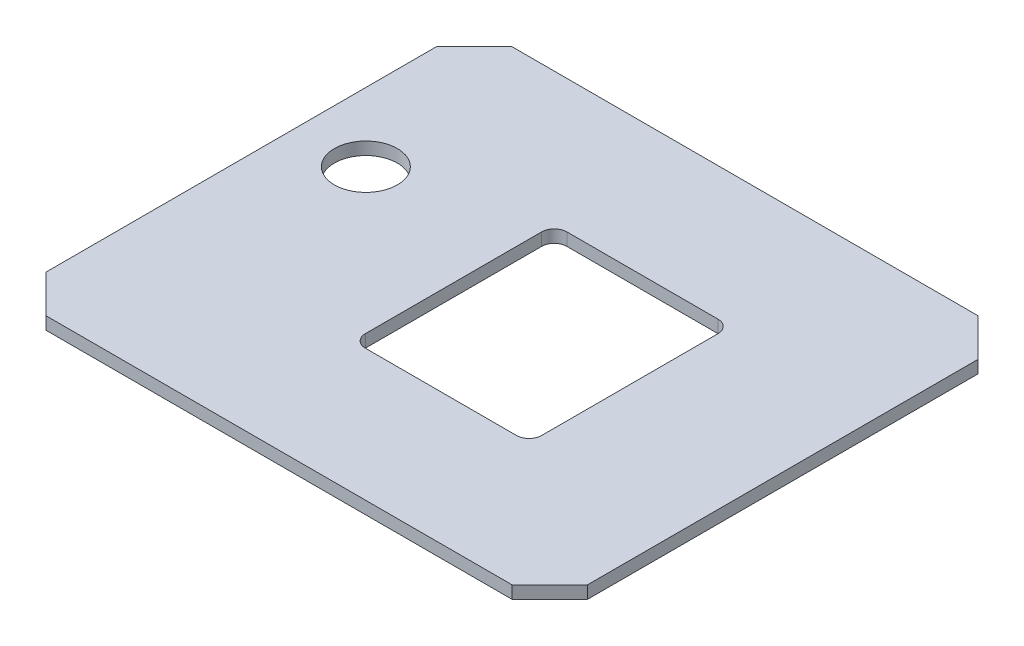
ISO-10303-21;
HEADER;
FILE_DESCRIPTION(('STEP AP214'),'2;1');
FILE_NAME('part.step','',(''),(''),'','','');
FILE_SCHEMA(('AUTOMOTIVE_DESIGN { 1 0 10303 214 1 1 1 1 }'));
ENDSEC;
DATA;
#1=APPLICATION_CONTEXT('core data for automotive mechanical design processes');
#2=APPLICATION_PROTOCOL_DEFINITION('international standard','automotive_design',2000,#1);
#3=PRODUCT_CONTEXT('',#1,'mechanical');
#4=PRODUCT('Part','Part','',(#3));
#5=PRODUCT_RELATED_PRODUCT_CATEGORY('part','',(#4));
#6=PRODUCT_DEFINITION_FORMATION('','',#4);
#7=PRODUCT_DEFINITION_CONTEXT('part definition',#1,'design');
#8=PRODUCT_DEFINITION('design','',#6,#7);
#9=PRODUCT_DEFINITION_SHAPE('','',#8);
#10=(LENGTH_UNIT() NAMED_UNIT(*) SI_UNIT(.MILLI.,.METRE.));
#11=(NAMED_UNIT(*) PLANE_ANGLE_UNIT() SI_UNIT($,.RADIAN.));
#12=(NAMED_UNIT(*) SI_UNIT($,.STERADIAN.) SOLID_ANGLE_UNIT());
#13=UNCERTAINTY_MEASURE_WITH_UNIT(LENGTH_MEASURE(1.E-05),#10,'distance_accuracy_value','');
#14=(GEOMETRIC_REPRESENTATION_CONTEXT(3) GLOBAL_UNCERTAINTY_ASSIGNED_CONTEXT((#13)) GLOBAL_UNIT_ASSIGNED_CONTEXT((#10,
#11,#12)) REPRESENTATION_CONTEXT('',''));
#15=CARTESIAN_POINT('',(0.,0.,0.));
#16=DIRECTION('',(0.,0.,1.));
#17=DIRECTION('',(1.,0.,0.));
#18=AXIS2_PLACEMENT_3D('',#15,#16,#17);
#19=CARTESIAN_POINT('',(0.,0.,0.));
#20=DIRECTION('',(0.,1.,0.));
#21=DIRECTION('',(1.,0.,0.));
#22=AXIS2_PLACEMENT_3D('',#19,#20,#21);
#23=PLANE('',#22);
#24=CARTESIAN_POINT('',(-184.6,0.,-45.));
#25=DIRECTION('',(0.,1.,0.));
#26=DIRECTION('',(0.,0.,1.));
#27=AXIS2_PLACEMENT_3D('',#24,#25,#26);
#28=CIRCLE('',#27,25.);
#29=CARTESIAN_POINT('',(-184.6,0.,-20.));
#30=VERTEX_POINT('',#29);
#31=EDGE_CURVE('E359',#30,#30,#28,.T.);
#32=ORIENTED_EDGE('',*,*,#31,.T.);
#33=EDGE_LOOP('',(#32));
#34=FACE_BOUND('',#33,.T.);
#35=CARTESIAN_POINT('',(60.,0.,-70.));
#36=DIRECTION('',(0.,1.,0.));
#37=DIRECTION('',(0.,0.,1.));
#38=AXIS2_PLACEMENT_3D('',#35,#36,#37);
#39=CIRCLE('',#38,10.);
#40=CARTESIAN_POINT('',(70.,0.,-70.));
#41=VERTEX_POINT('',#40);
#42=CARTESIAN_POINT('',(60.,0.,-80.));
#43=VERTEX_POINT('',#42);
#44=EDGE_CURVE('E284',#41,#43,#39,.T.);
#45=ORIENTED_EDGE('',*,*,#44,.T.);
#46=DIRECTION('',(-1.,0.,0.));
#47=VECTOR('',#46,1.);
#48=CARTESIAN_POINT('',(-70.,0.,-80.));
#49=LINE('',#48,#47);
#50=CARTESIAN_POINT('',(-60.,0.,-80.));
#51=VERTEX_POINT('',#50);
#52=EDGE_CURVE('E302',#43,#51,#49,.T.);
#53=ORIENTED_EDGE('',*,*,#52,.T.);
#54=CARTESIAN_POINT('',(-60.,0.,-70.));
#55=DIRECTION('',(0.,1.,0.));
#56=DIRECTION('',(0.,0.,1.));
#57=AXIS2_PLACEMENT_3D('',#54,#55,#56);
#58=CIRCLE('',#57,10.);
#59=CARTESIAN_POINT('',(-70.,0.,-70.));
#60=VERTEX_POINT('',#59);
#61=EDGE_CURVE('E237',#51,#60,#58,.T.);
#62=ORIENTED_EDGE('',*,*,#61,.T.);
#63=DIRECTION('',(0.,0.,1.));
#64=VECTOR('',#63,1.);
#65=CARTESIAN_POINT('',(-70.,0.,80.));
#66=LINE('',#65,#64);
#67=CARTESIAN_POINT('',(-70.,0.,70.));
#68=VERTEX_POINT('',#67);
#69=EDGE_CURVE('E312',#60,#68,#66,.T.);
#70=ORIENTED_EDGE('',*,*,#69,.T.);
#71=CARTESIAN_POINT('',(-60.,0.,70.));
#72=DIRECTION('',(0.,1.,0.));
#73=DIRECTION('',(0.,0.,1.));
#74=AXIS2_PLACEMENT_3D('',#71,#72,#73);
#75=CIRCLE('',#74,10.);
#76=CARTESIAN_POINT('',(-60.,0.,80.));
#77=VERTEX_POINT('',#76);
#78=EDGE_CURVE('E320',#68,#77,#75,.T.);
#79=ORIENTED_EDGE('',*,*,#78,.T.);
#80=DIRECTION('',(1.,0.,0.));
#81=VECTOR('',#80,1.);
#82=CARTESIAN_POINT('',(70.,0.,80.));
#83=LINE('',#82,#81);
#84=CARTESIAN_POINT('',(60.,0.,80.));
#85=VERTEX_POINT('',#84);
#86=EDGE_CURVE('E296',#77,#85,#83,.T.);
#87=ORIENTED_EDGE('',*,*,#86,.T.);
#88=CARTESIAN_POINT('',(60.,0.,70.));
#89=DIRECTION('',(0.,1.,0.));
#90=DIRECTION('',(0.,0.,1.));
#91=AXIS2_PLACEMENT_3D('',#88,#89,#90);
#92=CIRCLE('',#91,10.);
#93=CARTESIAN_POINT('',(70.,0.,70.));
#94=VERTEX_POINT('',#93);
#95=EDGE_CURVE('E257',#85,#94,#92,.T.);
#96=ORIENTED_EDGE('',*,*,#95,.T.);
#97=DIRECTION('',(0.,0.,-1.));
#98=VECTOR('',#97,1.);
#99=CARTESIAN_POINT('',(70.,0.,-80.));
#100=LINE('',#99,#98);
#101=EDGE_CURVE('E256',#94,#41,#100,.T.);
#102=ORIENTED_EDGE('',*,*,#101,.T.);
#103=EDGE_LOOP('',(#45,#53,#62,#70,#79,#87,#96,#102));
#104=FACE_BOUND('',#103,.T.);
#105=DIRECTION('',(0.707106781186549,0.,0.707106781186546));
#106=VECTOR('',#105,1.);
#107=CARTESIAN_POINT('',(190.888539522842,2.22044604925032E-13,-155.547778770997));
#108=LINE('',#107,#106);
#109=CARTESIAN_POINT('',(160.888539522842,1.11022302462516E-13,-185.547778770997));
#110=VERTEX_POINT('',#109);
#111=CARTESIAN_POINT('',(190.888539522842,0.,-155.547778770997));
#112=VERTEX_POINT('',#111);
#113=EDGE_CURVE('E26',#110,#112,#108,.T.);
#114=ORIENTED_EDGE('',*,*,#113,.T.);
#115=DIRECTION('',(0.,0.,-1.));
#116=VECTOR('',#115,1.);
#117=CARTESIAN_POINT('',(190.888539522842,0.,-185.547778770997));
#118=LINE('',#117,#116);
#119=CARTESIAN_POINT('',(190.888539522842,0.,154.452221229003));
#120=VERTEX_POINT('',#119);
#121=EDGE_CURVE('E11',#120,#112,#118,.T.);
#122=ORIENTED_EDGE('',*,*,#121,.F.);
#123=DIRECTION('',(-0.707106781186546,0.,0.707106781186549));
#124=VECTOR('',#123,1.);
#125=CARTESIAN_POINT('',(160.888539522842,2.22044604925032E-13,184.452221229003));
#126=LINE('',#125,#124);
#127=CARTESIAN_POINT('',(160.888539522842,0.,184.452221229003));
#128=VERTEX_POINT('',#127);
#129=EDGE_CURVE('E316',#120,#128,#126,.T.);
#130=ORIENTED_EDGE('',*,*,#129,.T.);
#131=DIRECTION('',(1.,0.,0.));
#132=VECTOR('',#131,1.);
#133=CARTESIAN_POINT('',(190.888539522842,0.,184.452221229003));
#134=LINE('',#133,#132);
#135=CARTESIAN_POINT('',(-209.111460477158,0.,184.452221229003));
#136=VERTEX_POINT('',#135);
#137=EDGE_CURVE('E253',#136,#128,#134,.T.);
#138=ORIENTED_EDGE('',*,*,#137,.F.);
#139=DIRECTION('',(-0.707106781186549,0.,-0.707106781186547));
#140=VECTOR('',#139,1.);
#141=CARTESIAN_POINT('',(-239.111460477159,0.,154.452221229003));
#142=LINE('',#141,#140);
#143=CARTESIAN_POINT('',(-239.111460477159,0.,154.452221229003));
#144=VERTEX_POINT('',#143);
#145=EDGE_CURVE('E342',#136,#144,#142,.T.);
#146=ORIENTED_EDGE('',*,*,#145,.T.);
#147=DIRECTION('',(0.,0.,1.));
#148=VECTOR('',#147,1.);
#149=CARTESIAN_POINT('',(-239.111460477159,0.,-185.547778770997));
#150=LINE('',#149,#148);
#151=CARTESIAN_POINT('',(-239.111460477159,1.11022302462516E-13,-155.547778770996));
#152=VERTEX_POINT('',#151);
#153=EDGE_CURVE('E175',#152,#144,#150,.T.);
#154=ORIENTED_EDGE('',*,*,#153,.F.);
#155=DIRECTION('',(0.707106781186546,0.,-0.707106781186549));
#156=VECTOR('',#155,1.);
#157=CARTESIAN_POINT('',(-209.111460477158,2.22044604925032E-13,-185.547778770997));
#158=LINE('',#157,#156);
#159=CARTESIAN_POINT('',(-209.111460477158,0.,-185.547778770997));
#160=VERTEX_POINT('',#159);
#161=EDGE_CURVE('E171',#152,#160,#158,.T.);
#162=ORIENTED_EDGE('',*,*,#161,.T.);
#163=DIRECTION('',(-1.,0.,0.));
#164=VECTOR('',#163,1.);
#165=CARTESIAN_POINT('',(190.888539522842,0.,-185.547778770997));
#166=LINE('',#165,#164);
#167=EDGE_CURVE('E161',#110,#160,#166,.T.);
#168=ORIENTED_EDGE('',*,*,#167,.F.);
#169=EDGE_LOOP('',(#114,#122,#130,#138,#146,#154,#162,#168));
#170=FACE_BOUND('',#169,.T.);
#171=ADVANCED_FACE('F17',(#34,#104,#170),#23,.F.);
#172=CARTESIAN_POINT('',(190.888539522842,-567.274184147314,-185.547778770997));
#173=DIRECTION('',(1.,0.,0.));
#174=DIRECTION('',(0.,0.,-1.));
#175=AXIS2_PLACEMENT_3D('',#172,#173,#174);
#176=PLANE('',#175);
#177=DIRECTION('',(0.,0.,-1.));
#178=VECTOR('',#177,1.);
#179=CARTESIAN_POINT('',(190.888539522842,10.,0.));
#180=LINE('',#179,#178);
#181=CARTESIAN_POINT('',(190.888539522842,10.,154.452221229003));
#182=VERTEX_POINT('',#181);
#183=CARTESIAN_POINT('',(190.888539522842,10.,-155.547778770997));
#184=VERTEX_POINT('',#183);
#185=EDGE_CURVE('E211',#182,#184,#180,.T.);
#186=ORIENTED_EDGE('',*,*,#185,.F.);
#187=DIRECTION('',(0.,-1.,0.));
#188=VECTOR('',#187,1.);
#189=CARTESIAN_POINT('',(190.888539522842,-567.274184147314,154.452221229003));
#190=LINE('',#189,#188);
#191=EDGE_CURVE('E213',#182,#120,#190,.T.);
#192=ORIENTED_EDGE('',*,*,#191,.T.);
#193=ORIENTED_EDGE('',*,*,#121,.T.);
#194=DIRECTION('',(0.,1.,0.));
#195=VECTOR('',#194,1.);
#196=CARTESIAN_POINT('',(190.888539522842,-567.274184147314,-155.547778770997));
#197=LINE('',#196,#195);
#198=EDGE_CURVE('E195',#112,#184,#197,.T.);
#199=ORIENTED_EDGE('',*,*,#198,.T.);
#200=EDGE_LOOP('',(#186,#192,#193,#199));
#201=FACE_BOUND('',#200,.T.);
#202=ADVANCED_FACE('F210',(#201),#176,.T.);
#203=CARTESIAN_POINT('',(190.888539522842,-567.274184147314,-155.547778770997));
#204=DIRECTION('',(-0.707106781186546,0.,0.707106781186549));
#205=DIRECTION('',(0.,1.,0.));
#206=AXIS2_PLACEMENT_3D('',#203,#204,#205);
#207=PLANE('',#206);
#208=DIRECTION('',(0.,-1.,0.));
#209=VECTOR('',#208,1.);
#210=CARTESIAN_POINT('',(160.888539522842,-567.274184147314,-185.547778770997));
#211=LINE('',#210,#209);
#212=CARTESIAN_POINT('',(160.888539522842,10.0000000000002,-185.547778770997));
#213=VERTEX_POINT('',#212);
#214=EDGE_CURVE('E168',#213,#110,#211,.T.);
#215=ORIENTED_EDGE('',*,*,#214,.F.);
#216=DIRECTION('',(-0.707106781186549,0.,-0.707106781186546));
#217=VECTOR('',#216,1.);
#218=CARTESIAN_POINT('',(190.888539522842,10.,-155.547778770997));
#219=LINE('',#218,#217);
#220=EDGE_CURVE('E207',#184,#213,#219,.T.);
#221=ORIENTED_EDGE('',*,*,#220,.F.);
#222=ORIENTED_EDGE('',*,*,#198,.F.);
#223=ORIENTED_EDGE('',*,*,#113,.F.);
#224=EDGE_LOOP('',(#215,#221,#222,#223));
#225=FACE_BOUND('',#224,.T.);
#226=ADVANCED_FACE('F205',(#225),#207,.F.);
#227=CARTESIAN_POINT('',(190.888539522842,-567.274184147314,-185.547778770997));
#228=DIRECTION('',(0.,0.,-1.));
#229=DIRECTION('',(-1.,0.,0.));
#230=AXIS2_PLACEMENT_3D('',#227,#228,#229);
#231=PLANE('',#230);
#232=ORIENTED_EDGE('',*,*,#167,.T.);
#233=DIRECTION('',(0.,1.,0.));
#234=VECTOR('',#233,1.);
#235=CARTESIAN_POINT('',(-209.111460477158,-567.274184147314,-185.547778770997));
#236=LINE('',#235,#234);
#237=CARTESIAN_POINT('',(-209.111460477158,10.,-185.547778770997));
#238=VERTEX_POINT('',#237);
#239=EDGE_CURVE('E166',#160,#238,#236,.T.);
#240=ORIENTED_EDGE('',*,*,#239,.T.);
#241=DIRECTION('',(-1.,0.,0.));
#242=VECTOR('',#241,1.);
#243=CARTESIAN_POINT('',(0.,10.,-185.547778770997));
#244=LINE('',#243,#242);
#245=EDGE_CURVE('E261',#213,#238,#244,.T.);
#246=ORIENTED_EDGE('',*,*,#245,.F.);
#247=ORIENTED_EDGE('',*,*,#214,.T.);
#248=EDGE_LOOP('',(#232,#240,#246,#247));
#249=FACE_BOUND('',#248,.T.);
#250=ADVANCED_FACE('F163',(#249),#231,.T.);
#251=CARTESIAN_POINT('',(-209.111460477158,-567.274184147314,-185.547778770997));
#252=DIRECTION('',(0.707106781186549,0.,0.707106781186546));
#253=DIRECTION('',(0.,-1.,0.));
#254=AXIS2_PLACEMENT_3D('',#251,#252,#253);
#255=PLANE('',#254);
#256=DIRECTION('',(0.,-1.,0.));
#257=VECTOR('',#256,1.);
#258=CARTESIAN_POINT('',(-239.111460477159,-567.274184147314,-155.547778770996));
#259=LINE('',#258,#257);
#260=CARTESIAN_POINT('',(-239.111460477159,10.0000000000002,-155.547778770996));
#261=VERTEX_POINT('',#260);
#262=EDGE_CURVE('E185',#261,#152,#259,.T.);
#263=ORIENTED_EDGE('',*,*,#262,.F.);
#264=DIRECTION('',(-0.707106781186546,0.,0.707106781186549));
#265=VECTOR('',#264,1.);
#266=CARTESIAN_POINT('',(-209.111460477158,10.,-185.547778770997));
#267=LINE('',#266,#265);
#268=EDGE_CURVE('E182',#238,#261,#267,.T.);
#269=ORIENTED_EDGE('',*,*,#268,.F.);
#270=ORIENTED_EDGE('',*,*,#239,.F.);
#271=ORIENTED_EDGE('',*,*,#161,.F.);
#272=EDGE_LOOP('',(#263,#269,#270,#271));
#273=FACE_BOUND('',#272,.T.);
#274=ADVANCED_FACE('F180',(#273),#255,.F.);
#275=CARTESIAN_POINT('',(-239.111460477159,-567.274184147314,-185.547778770997));
#276=DIRECTION('',(-1.,0.,0.));
#277=DIRECTION('',(0.,0.,1.));
#278=AXIS2_PLACEMENT_3D('',#275,#276,#277);
#279=PLANE('',#278);
#280=ORIENTED_EDGE('',*,*,#153,.T.);
#281=DIRECTION('',(0.,1.,0.));
#282=VECTOR('',#281,1.);
#283=CARTESIAN_POINT('',(-239.111460477159,-567.274184147314,154.452221229003));
#284=LINE('',#283,#282);
#285=CARTESIAN_POINT('',(-239.111460477159,10.,154.452221229003));
#286=VERTEX_POINT('',#285);
#287=EDGE_CURVE('E252',#144,#286,#284,.T.);
#288=ORIENTED_EDGE('',*,*,#287,.T.);
#289=DIRECTION('',(0.,0.,1.));
#290=VECTOR('',#289,1.);
#291=CARTESIAN_POINT('',(-239.111460477159,10.,0.));
#292=LINE('',#291,#290);
#293=EDGE_CURVE('E243',#261,#286,#292,.T.);
#294=ORIENTED_EDGE('',*,*,#293,.F.);
#295=ORIENTED_EDGE('',*,*,#262,.T.);
#296=EDGE_LOOP('',(#280,#288,#294,#295));
#297=FACE_BOUND('',#296,.T.);
#298=ADVANCED_FACE('F622',(#297),#279,.T.);
#299=CARTESIAN_POINT('',(-239.111460477159,-567.274184147314,154.452221229003));
#300=DIRECTION('',(0.707106781186547,0.,-0.707106781186548));
#301=DIRECTION('',(0.,-1.,0.));
#302=AXIS2_PLACEMENT_3D('',#299,#300,#301);
#303=PLANE('',#302);
#304=DIRECTION('',(0.,-1.,0.));
#305=VECTOR('',#304,1.);
#306=CARTESIAN_POINT('',(-209.111460477158,-567.274184147314,184.452221229003));
#307=LINE('',#306,#305);
#308=CARTESIAN_POINT('',(-209.111460477158,10.,184.452221229003));
#309=VERTEX_POINT('',#308);
#310=EDGE_CURVE('E248',#309,#136,#307,.T.);
#311=ORIENTED_EDGE('',*,*,#310,.F.);
#312=DIRECTION('',(0.707106781186548,0.,0.707106781186547));
#313=VECTOR('',#312,1.);
#314=CARTESIAN_POINT('',(-239.111460477159,10.,154.452221229003));
#315=LINE('',#314,#313);
#316=EDGE_CURVE('E247',#286,#309,#315,.T.);
#317=ORIENTED_EDGE('',*,*,#316,.F.);
#318=ORIENTED_EDGE('',*,*,#287,.F.);
#319=ORIENTED_EDGE('',*,*,#145,.F.);
#320=EDGE_LOOP('',(#311,#317,#318,#319));
#321=FACE_BOUND('',#320,.T.);
#322=ADVANCED_FACE('F599',(#321),#303,.F.);
#323=CARTESIAN_POINT('',(190.888539522842,-567.274184147314,184.452221229003));
#324=DIRECTION('',(0.,0.,1.));
#325=DIRECTION('',(1.,0.,0.));
#326=AXIS2_PLACEMENT_3D('',#323,#324,#325);
#327=PLANE('',#326);
#328=ORIENTED_EDGE('',*,*,#137,.T.);
#329=DIRECTION('',(0.,1.,0.));
#330=VECTOR('',#329,1.);
#331=CARTESIAN_POINT('',(160.888539522842,-567.274184147314,184.452221229003));
#332=LINE('',#331,#330);
#333=CARTESIAN_POINT('',(160.888539522842,10.,184.452221229003));
#334=VERTEX_POINT('',#333);
#335=EDGE_CURVE('E313',#128,#334,#332,.T.);
#336=ORIENTED_EDGE('',*,*,#335,.T.);
#337=DIRECTION('',(1.,0.,0.));
#338=VECTOR('',#337,1.);
#339=CARTESIAN_POINT('',(0.,10.,184.452221229003));
#340=LINE('',#339,#338);
#341=EDGE_CURVE('E223',#309,#334,#340,.T.);
#342=ORIENTED_EDGE('',*,*,#341,.F.);
#343=ORIENTED_EDGE('',*,*,#310,.T.);
#344=EDGE_LOOP('',(#328,#336,#342,#343));
#345=FACE_BOUND('',#344,.T.);
#346=ADVANCED_FACE('F591',(#345),#327,.T.);
#347=CARTESIAN_POINT('',(160.888539522842,-567.274184147314,184.452221229003));
#348=DIRECTION('',(-0.707106781186549,0.,-0.707106781186546));
#349=DIRECTION('',(-0.707106781186546,0.,0.707106781186549));
#350=AXIS2_PLACEMENT_3D('',#347,#348,#349);
#351=PLANE('',#350);
#352=ORIENTED_EDGE('',*,*,#191,.F.);
#353=DIRECTION('',(0.707106781186546,0.,-0.707106781186549));
#354=VECTOR('',#353,1.);
#355=CARTESIAN_POINT('',(160.888539522842,10.,184.452221229003));
#356=LINE('',#355,#354);
#357=EDGE_CURVE('E216',#334,#182,#356,.T.);
#358=ORIENTED_EDGE('',*,*,#357,.F.);
#359=ORIENTED_EDGE('',*,*,#335,.F.);
#360=ORIENTED_EDGE('',*,*,#129,.F.);
#361=EDGE_LOOP('',(#352,#358,#359,#360));
#362=FACE_BOUND('',#361,.T.);
#363=ADVANCED_FACE('F587',(#362),#351,.F.);
#364=CARTESIAN_POINT('',(70.,0.,-80.));
#365=DIRECTION('',(1.,0.,0.));
#366=DIRECTION('',(0.,1.,0.));
#367=AXIS2_PLACEMENT_3D('',#364,#365,#366);
#368=PLANE('',#367);
#369=ORIENTED_EDGE('',*,*,#101,.F.);
#370=DIRECTION('',(0.,1.,0.));
#371=VECTOR('',#370,1.);
#372=CARTESIAN_POINT('',(70.,-13.036,70.));
#373=LINE('',#372,#371);
#374=CARTESIAN_POINT('',(70.,10.,70.));
#375=VERTEX_POINT('',#374);
#376=EDGE_CURVE('E254',#94,#375,#373,.T.);
#377=ORIENTED_EDGE('',*,*,#376,.T.);
#378=DIRECTION('',(0.,0.,1.));
#379=VECTOR('',#378,1.);
#380=CARTESIAN_POINT('',(70.,10.,0.));
#381=LINE('',#380,#379);
#382=CARTESIAN_POINT('',(70.,10.,-70.));
#383=VERTEX_POINT('',#382);
#384=EDGE_CURVE('E241',#383,#375,#381,.T.);
#385=ORIENTED_EDGE('',*,*,#384,.F.);
#386=DIRECTION('',(0.,-1.,0.));
#387=VECTOR('',#386,1.);
#388=CARTESIAN_POINT('',(70.,-13.036,-70.));
#389=LINE('',#388,#387);
#390=EDGE_CURVE('E288',#383,#41,#389,.T.);
#391=ORIENTED_EDGE('',*,*,#390,.T.);
#392=EDGE_LOOP('',(#369,#377,#385,#391));
#393=FACE_BOUND('',#392,.T.);
#394=ADVANCED_FACE('F405',(#393),#368,.F.);
#395=CARTESIAN_POINT('',(60.,-13.036,70.));
#396=DIRECTION('',(0.,1.,0.));
#397=DIRECTION('',(0.,0.,1.));
#398=AXIS2_PLACEMENT_3D('',#395,#396,#397);
#399=CYLINDRICAL_SURFACE('',#398,10.);
#400=ORIENTED_EDGE('',*,*,#95,.F.);
#401=DIRECTION('',(0.,1.,0.));
#402=VECTOR('',#401,1.);
#403=CARTESIAN_POINT('',(60.,0.,80.));
#404=LINE('',#403,#402);
#405=CARTESIAN_POINT('',(60.,10.,80.));
#406=VERTEX_POINT('',#405);
#407=EDGE_CURVE('E327',#85,#406,#404,.T.);
#408=ORIENTED_EDGE('',*,*,#407,.T.);
#409=CARTESIAN_POINT('',(60.,10.,70.));
#410=DIRECTION('',(0.,-1.,0.));
#411=DIRECTION('',(0.,0.,1.));
#412=AXIS2_PLACEMENT_3D('',#409,#410,#411);
#413=CIRCLE('',#412,10.);
#414=EDGE_CURVE('E272',#375,#406,#413,.T.);
#415=ORIENTED_EDGE('',*,*,#414,.F.);
#416=ORIENTED_EDGE('',*,*,#376,.F.);
#417=EDGE_LOOP('',(#400,#408,#415,#416));
#418=FACE_BOUND('',#417,.T.);
#419=ADVANCED_FACE('F378',(#418),#399,.F.);
#420=CARTESIAN_POINT('',(70.,0.,80.));
#421=DIRECTION('',(0.,0.,1.));
#422=DIRECTION('',(1.,0.,0.));
#423=AXIS2_PLACEMENT_3D('',#420,#421,#422);
#424=PLANE('',#423);
#425=DIRECTION('',(-1.,0.,0.));
#426=VECTOR('',#425,1.);
#427=CARTESIAN_POINT('',(0.,10.,80.));
#428=LINE('',#427,#426);
#429=CARTESIAN_POINT('',(-60.,10.,80.));
#430=VERTEX_POINT('',#429);
#431=EDGE_CURVE('E267',#406,#430,#428,.T.);
#432=ORIENTED_EDGE('',*,*,#431,.F.);
#433=ORIENTED_EDGE('',*,*,#407,.F.);
#434=ORIENTED_EDGE('',*,*,#86,.F.);
#435=DIRECTION('',(0.,1.,0.));
#436=VECTOR('',#435,1.);
#437=CARTESIAN_POINT('',(-60.,-13.036,80.));
#438=LINE('',#437,#436);
#439=EDGE_CURVE('E324',#77,#430,#438,.T.);
#440=ORIENTED_EDGE('',*,*,#439,.T.);
#441=EDGE_LOOP('',(#432,#433,#434,#440));
#442=FACE_BOUND('',#441,.T.);
#443=ADVANCED_FACE('F381',(#442),#424,.F.);
#444=CARTESIAN_POINT('',(-60.,-13.036,70.));
#445=DIRECTION('',(0.,1.,0.));
#446=DIRECTION('',(0.,0.,1.));
#447=AXIS2_PLACEMENT_3D('',#444,#445,#446);
#448=CYLINDRICAL_SURFACE('',#447,10.);
#449=ORIENTED_EDGE('',*,*,#78,.F.);
#450=DIRECTION('',(0.,1.,0.));
#451=VECTOR('',#450,1.);
#452=CARTESIAN_POINT('',(-70.,0.,70.));
#453=LINE('',#452,#451);
#454=CARTESIAN_POINT('',(-70.,10.,70.));
#455=VERTEX_POINT('',#454);
#456=EDGE_CURVE('E309',#68,#455,#453,.T.);
#457=ORIENTED_EDGE('',*,*,#456,.T.);
#458=CARTESIAN_POINT('',(-60.,10.,70.));
#459=DIRECTION('',(0.,-1.,0.));
#460=DIRECTION('',(0.,0.,1.));
#461=AXIS2_PLACEMENT_3D('',#458,#459,#460);
#462=CIRCLE('',#461,10.);
#463=EDGE_CURVE('E271',#430,#455,#462,.T.);
#464=ORIENTED_EDGE('',*,*,#463,.F.);
#465=ORIENTED_EDGE('',*,*,#439,.F.);
#466=EDGE_LOOP('',(#449,#457,#464,#465));
#467=FACE_BOUND('',#466,.T.);
#468=ADVANCED_FACE('F385',(#467),#448,.F.);
#469=CARTESIAN_POINT('',(-70.,0.,80.));
#470=DIRECTION('',(-1.,0.,0.));
#471=DIRECTION('',(0.,0.,1.));
#472=AXIS2_PLACEMENT_3D('',#469,#470,#471);
#473=PLANE('',#472);
#474=DIRECTION('',(0.,0.,-1.));
#475=VECTOR('',#474,1.);
#476=CARTESIAN_POINT('',(-70.,10.,0.));
#477=LINE('',#476,#475);
#478=CARTESIAN_POINT('',(-70.,10.,-70.));
#479=VERTEX_POINT('',#478);
#480=EDGE_CURVE('E276',#455,#479,#477,.T.);
#481=ORIENTED_EDGE('',*,*,#480,.F.);
#482=ORIENTED_EDGE('',*,*,#456,.F.);
#483=ORIENTED_EDGE('',*,*,#69,.F.);
#484=DIRECTION('',(0.,1.,0.));
#485=VECTOR('',#484,1.);
#486=CARTESIAN_POINT('',(-70.,-13.036,-70.));
#487=LINE('',#486,#485);
#488=EDGE_CURVE('E306',#60,#479,#487,.T.);
#489=ORIENTED_EDGE('',*,*,#488,.T.);
#490=EDGE_LOOP('',(#481,#482,#483,#489));
#491=FACE_BOUND('',#490,.T.);
#492=ADVANCED_FACE('F391',(#491),#473,.F.);
#493=CARTESIAN_POINT('',(-60.,-13.036,-70.));
#494=DIRECTION('',(0.,1.,0.));
#495=DIRECTION('',(0.,0.,1.));
#496=AXIS2_PLACEMENT_3D('',#493,#494,#495);
#497=CYLINDRICAL_SURFACE('',#496,10.);
#498=ORIENTED_EDGE('',*,*,#61,.F.);
#499=DIRECTION('',(0.,1.,0.));
#500=VECTOR('',#499,1.);
#501=CARTESIAN_POINT('',(-60.,0.,-80.));
#502=LINE('',#501,#500);
#503=CARTESIAN_POINT('',(-60.,10.,-80.));
#504=VERTEX_POINT('',#503);
#505=EDGE_CURVE('E299',#51,#504,#502,.T.);
#506=ORIENTED_EDGE('',*,*,#505,.T.);
#507=CARTESIAN_POINT('',(-60.,10.,-70.));
#508=DIRECTION('',(0.,-1.,0.));
#509=DIRECTION('',(0.,0.,1.));
#510=AXIS2_PLACEMENT_3D('',#507,#508,#509);
#511=CIRCLE('',#510,10.);
#512=EDGE_CURVE('E280',#479,#504,#511,.T.);
#513=ORIENTED_EDGE('',*,*,#512,.F.);
#514=ORIENTED_EDGE('',*,*,#488,.F.);
#515=EDGE_LOOP('',(#498,#506,#513,#514));
#516=FACE_BOUND('',#515,.T.);
#517=ADVANCED_FACE('F395',(#516),#497,.F.);
#518=CARTESIAN_POINT('',(-70.,0.,-80.));
#519=DIRECTION('',(0.,0.,-1.));
#520=DIRECTION('',(0.,-1.,0.));
#521=AXIS2_PLACEMENT_3D('',#518,#519,#520);
#522=PLANE('',#521);
#523=DIRECTION('',(1.,0.,0.));
#524=VECTOR('',#523,1.);
#525=CARTESIAN_POINT('',(0.,10.,-80.));
#526=LINE('',#525,#524);
#527=CARTESIAN_POINT('',(60.,10.,-80.));
#528=VERTEX_POINT('',#527);
#529=EDGE_CURVE('E242',#504,#528,#526,.T.);
#530=ORIENTED_EDGE('',*,*,#529,.F.);
#531=ORIENTED_EDGE('',*,*,#505,.F.);
#532=ORIENTED_EDGE('',*,*,#52,.F.);
#533=DIRECTION('',(0.,1.,0.));
#534=VECTOR('',#533,1.);
#535=CARTESIAN_POINT('',(60.,-13.036,-80.));
#536=LINE('',#535,#534);
#537=EDGE_CURVE('E292',#43,#528,#536,.T.);
#538=ORIENTED_EDGE('',*,*,#537,.T.);
#539=EDGE_LOOP('',(#530,#531,#532,#538));
#540=FACE_BOUND('',#539,.T.);
#541=ADVANCED_FACE('F398',(#540),#522,.F.);
#542=CARTESIAN_POINT('',(60.,-13.036,-70.));
#543=DIRECTION('',(0.,1.,0.));
#544=DIRECTION('',(0.,0.,1.));
#545=AXIS2_PLACEMENT_3D('',#542,#543,#544);
#546=CYLINDRICAL_SURFACE('',#545,10.);
#547=ORIENTED_EDGE('',*,*,#44,.F.);
#548=ORIENTED_EDGE('',*,*,#390,.F.);
#549=CARTESIAN_POINT('',(60.,10.,-70.));
#550=DIRECTION('',(0.,-1.,0.));
#551=DIRECTION('',(0.,0.,1.));
#552=AXIS2_PLACEMENT_3D('',#549,#550,#551);
#553=CIRCLE('',#552,10.);
#554=EDGE_CURVE('E238',#528,#383,#553,.T.);
#555=ORIENTED_EDGE('',*,*,#554,.F.);
#556=ORIENTED_EDGE('',*,*,#537,.F.);
#557=EDGE_LOOP('',(#547,#548,#555,#556));
#558=FACE_BOUND('',#557,.T.);
#559=ADVANCED_FACE('F403',(#558),#546,.F.);
#560=CARTESIAN_POINT('',(0.,10.,0.));
#561=DIRECTION('',(0.,1.,0.));
#562=DIRECTION('',(1.,0.,0.));
#563=AXIS2_PLACEMENT_3D('',#560,#561,#562);
#564=PLANE('',#563);
#565=CARTESIAN_POINT('',(-184.6,10.,-45.));
#566=DIRECTION('',(0.,-1.,0.));
#567=DIRECTION('',(0.,0.,1.));
#568=AXIS2_PLACEMENT_3D('',#565,#566,#567);
#569=CIRCLE('',#568,25.);
#570=CARTESIAN_POINT('',(-184.6,10.,-20.));
#571=VERTEX_POINT('',#570);
#572=EDGE_CURVE('E233',#571,#571,#569,.T.);
#573=ORIENTED_EDGE('',*,*,#572,.T.);
#574=EDGE_LOOP('',(#573));
#575=FACE_BOUND('',#574,.T.);
#576=ORIENTED_EDGE('',*,*,#529,.T.);
#577=ORIENTED_EDGE('',*,*,#554,.T.);
#578=ORIENTED_EDGE('',*,*,#384,.T.);
#579=ORIENTED_EDGE('',*,*,#414,.T.);
#580=ORIENTED_EDGE('',*,*,#431,.T.);
#581=ORIENTED_EDGE('',*,*,#463,.T.);
#582=ORIENTED_EDGE('',*,*,#480,.T.);
#583=ORIENTED_EDGE('',*,*,#512,.T.);
#584=EDGE_LOOP('',(#576,#577,#578,#579,#580,#581,#582,#583));
#585=FACE_BOUND('',#584,.T.);
#586=ORIENTED_EDGE('',*,*,#341,.T.);
#587=ORIENTED_EDGE('',*,*,#357,.T.);
#588=ORIENTED_EDGE('',*,*,#185,.T.);
#589=ORIENTED_EDGE('',*,*,#220,.T.);
#590=ORIENTED_EDGE('',*,*,#245,.T.);
#591=ORIENTED_EDGE('',*,*,#268,.T.);
#592=ORIENTED_EDGE('',*,*,#293,.T.);
#593=ORIENTED_EDGE('',*,*,#316,.T.);
#594=EDGE_LOOP('',(#586,#587,#588,#589,#590,#591,#592,#593));
#595=FACE_BOUND('',#594,.T.);
#596=ADVANCED_FACE('F220',(#575,#585,#595),#564,.T.);
#597=CARTESIAN_POINT('',(-184.6,0.,-45.));
#598=DIRECTION('',(0.,1.,0.));
#599=DIRECTION('',(0.,0.,1.));
#600=AXIS2_PLACEMENT_3D('',#597,#598,#599);
#601=CYLINDRICAL_SURFACE('',#600,25.);
#602=ORIENTED_EDGE('',*,*,#572,.F.);
#603=EDGE_LOOP('',(#602));
#604=FACE_BOUND('',#603,.T.);
#605=ORIENTED_EDGE('',*,*,#31,.F.);
#606=EDGE_LOOP('',(#605));
#607=FACE_BOUND('',#606,.T.);
#608=ADVANCED_FACE('F440',(#604,#607),#601,.F.);
#609=CLOSED_SHELL('',(#171,#202,#226,#250,#274,#298,#322,#346,#363,#394,#419,#443,#468,#492,
#517,#541,#559,#596,#608));
#610=MANIFOLD_SOLID_BREP('B1',#609);
#611=ADVANCED_BREP_SHAPE_REPRESENTATION('',(#18,#610),#14);
#612=SHAPE_DEFINITION_REPRESENTATION(#9,#611);
ENDSEC;
END-ISO-10303-21;
